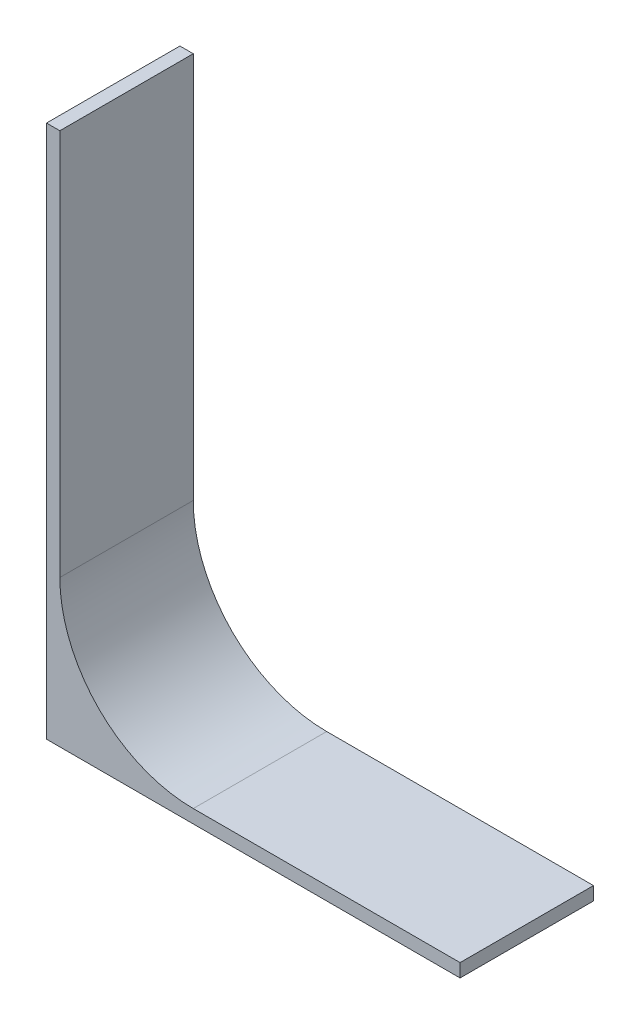
ISO-10303-21;
HEADER;
FILE_DESCRIPTION(('STEP AP214'),'2;1');
FILE_NAME('part.step','',(''),(''),'','','');
FILE_SCHEMA(('AUTOMOTIVE_DESIGN { 1 0 10303 214 1 1 1 1 }'));
ENDSEC;
DATA;
#1=APPLICATION_CONTEXT('core data for automotive mechanical design processes');
#2=APPLICATION_PROTOCOL_DEFINITION('international standard','automotive_design',2000,#1);
#3=PRODUCT_CONTEXT('',#1,'mechanical');
#4=PRODUCT('Part','Part','',(#3));
#5=PRODUCT_RELATED_PRODUCT_CATEGORY('part','',(#4));
#6=PRODUCT_DEFINITION_FORMATION('','',#4);
#7=PRODUCT_DEFINITION_CONTEXT('part definition',#1,'design');
#8=PRODUCT_DEFINITION('design','',#6,#7);
#9=PRODUCT_DEFINITION_SHAPE('','',#8);
#10=(LENGTH_UNIT() NAMED_UNIT(*) SI_UNIT(.MILLI.,.METRE.));
#11=(NAMED_UNIT(*) PLANE_ANGLE_UNIT() SI_UNIT($,.RADIAN.));
#12=(NAMED_UNIT(*) SI_UNIT($,.STERADIAN.) SOLID_ANGLE_UNIT());
#13=UNCERTAINTY_MEASURE_WITH_UNIT(LENGTH_MEASURE(1.E-05),#10,'distance_accuracy_value','');
#14=(GEOMETRIC_REPRESENTATION_CONTEXT(3) GLOBAL_UNCERTAINTY_ASSIGNED_CONTEXT((#13)) GLOBAL_UNIT_ASSIGNED_CONTEXT((#10,
#11,#12)) REPRESENTATION_CONTEXT('',''));
#15=CARTESIAN_POINT('',(0.,0.,0.));
#16=DIRECTION('',(0.,0.,1.));
#17=DIRECTION('',(1.,0.,0.));
#18=AXIS2_PLACEMENT_3D('',#15,#16,#17);
#19=CARTESIAN_POINT('',(10.,11.,0.));
#20=DIRECTION('',(0.,0.,-1.));
#21=DIRECTION('',(-1.,0.,0.));
#22=AXIS2_PLACEMENT_3D('',#19,#20,#21);
#23=CYLINDRICAL_SURFACE('',#22,10.);
#24=DIRECTION('',(0.,0.,1.));
#25=VECTOR('',#24,1.);
#26=CARTESIAN_POINT('',(10.,1.,0.));
#27=LINE('',#26,#25);
#28=CARTESIAN_POINT('',(10.,1.,-10.));
#29=VERTEX_POINT('',#28);
#30=CARTESIAN_POINT('',(10.,1.,0.));
#31=VERTEX_POINT('',#30);
#32=EDGE_CURVE('E167',#29,#31,#27,.T.);
#33=ORIENTED_EDGE('',*,*,#32,.F.);
#34=CARTESIAN_POINT('',(10.,11.,-10.));
#35=DIRECTION('',(0.,0.,1.));
#36=DIRECTION('',(1.,0.,0.));
#37=AXIS2_PLACEMENT_3D('',#34,#35,#36);
#38=CIRCLE('',#37,10.);
#39=CARTESIAN_POINT('',(0.,11.,-10.));
#40=VERTEX_POINT('',#39);
#41=EDGE_CURVE('E47',#29,#40,#38,.F.);
#42=ORIENTED_EDGE('',*,*,#41,.T.);
#43=DIRECTION('',(0.,0.,1.));
#44=VECTOR('',#43,1.);
#45=CARTESIAN_POINT('',(0.,11.,0.));
#46=LINE('',#45,#44);
#47=CARTESIAN_POINT('',(0.,11.,0.));
#48=VERTEX_POINT('',#47);
#49=EDGE_CURVE('E171',#48,#40,#46,.F.);
#50=ORIENTED_EDGE('',*,*,#49,.F.);
#51=CARTESIAN_POINT('',(10.,11.,0.));
#52=DIRECTION('',(0.,0.,-1.));
#53=DIRECTION('',(-1.,0.,0.));
#54=AXIS2_PLACEMENT_3D('',#51,#52,#53);
#55=CIRCLE('',#54,10.);
#56=EDGE_CURVE('E11',#48,#31,#55,.F.);
#57=ORIENTED_EDGE('',*,*,#56,.T.);
#58=EDGE_LOOP('',(#33,#42,#50,#57));
#59=FACE_BOUND('',#58,.T.);
#60=ADVANCED_FACE('F39',(#59),#23,.F.);
#61=CARTESIAN_POINT('',(0.,1.,0.));
#62=DIRECTION('',(0.,0.,-1.));
#63=DIRECTION('',(-1.,0.,0.));
#64=AXIS2_PLACEMENT_3D('',#61,#62,#63);
#65=PLANE('',#64);
#66=DIRECTION('',(1.,0.,0.));
#67=VECTOR('',#66,1.);
#68=CARTESIAN_POINT('',(0.,0.,0.));
#69=LINE('',#68,#67);
#70=CARTESIAN_POINT('',(-1.,0.,0.));
#71=VERTEX_POINT('',#70);
#72=CARTESIAN_POINT('',(30.,0.,0.));
#73=VERTEX_POINT('',#72);
#74=EDGE_CURVE('E96',#71,#73,#69,.T.);
#75=ORIENTED_EDGE('',*,*,#74,.T.);
#76=DIRECTION('',(0.,-1.,0.));
#77=VECTOR('',#76,1.);
#78=CARTESIAN_POINT('',(30.,1.,0.));
#79=LINE('',#78,#77);
#80=CARTESIAN_POINT('',(30.,1.,0.));
#81=VERTEX_POINT('',#80);
#82=EDGE_CURVE('E164',#81,#73,#79,.T.);
#83=ORIENTED_EDGE('',*,*,#82,.F.);
#84=DIRECTION('',(1.,0.,0.));
#85=VECTOR('',#84,1.);
#86=CARTESIAN_POINT('',(0.,1.,0.));
#87=LINE('',#86,#85);
#88=EDGE_CURVE('E145',#31,#81,#87,.T.);
#89=ORIENTED_EDGE('',*,*,#88,.F.);
#90=ORIENTED_EDGE('',*,*,#56,.F.);
#91=DIRECTION('',(0.,-1.,0.));
#92=VECTOR('',#91,1.);
#93=CARTESIAN_POINT('',(0.,0.,0.));
#94=LINE('',#93,#92);
#95=CARTESIAN_POINT('',(0.,40.,0.));
#96=VERTEX_POINT('',#95);
#97=EDGE_CURVE('E134',#96,#48,#94,.T.);
#98=ORIENTED_EDGE('',*,*,#97,.F.);
#99=DIRECTION('',(1.,0.,0.));
#100=VECTOR('',#99,1.);
#101=CARTESIAN_POINT('',(-1.,40.,0.));
#102=LINE('',#101,#100);
#103=CARTESIAN_POINT('',(-1.,40.,0.));
#104=VERTEX_POINT('',#103);
#105=EDGE_CURVE('E106',#104,#96,#102,.T.);
#106=ORIENTED_EDGE('',*,*,#105,.F.);
#107=DIRECTION('',(0.,-1.,0.));
#108=VECTOR('',#107,1.);
#109=CARTESIAN_POINT('',(-1.,0.,0.));
#110=LINE('',#109,#108);
#111=EDGE_CURVE('E113',#104,#71,#110,.T.);
#112=ORIENTED_EDGE('',*,*,#111,.T.);
#113=EDGE_LOOP('',(#75,#83,#89,#90,#98,#106,#112));
#114=FACE_BOUND('',#113,.T.);
#115=ADVANCED_FACE('F119',(#114),#65,.F.);
#116=CARTESIAN_POINT('',(30.,1.,0.));
#117=DIRECTION('',(-1.,0.,0.));
#118=DIRECTION('',(0.,0.,1.));
#119=AXIS2_PLACEMENT_3D('',#116,#117,#118);
#120=PLANE('',#119);
#121=DIRECTION('',(0.,0.,-1.));
#122=VECTOR('',#121,1.);
#123=CARTESIAN_POINT('',(30.,0.,0.));
#124=LINE('',#123,#122);
#125=CARTESIAN_POINT('',(30.,0.,-10.));
#126=VERTEX_POINT('',#125);
#127=EDGE_CURVE('E101',#73,#126,#124,.T.);
#128=ORIENTED_EDGE('',*,*,#127,.T.);
#129=DIRECTION('',(0.,-1.,0.));
#130=VECTOR('',#129,1.);
#131=CARTESIAN_POINT('',(30.,1.,-10.));
#132=LINE('',#131,#130);
#133=CARTESIAN_POINT('',(30.,1.,-10.));
#134=VERTEX_POINT('',#133);
#135=EDGE_CURVE('E155',#134,#126,#132,.T.);
#136=ORIENTED_EDGE('',*,*,#135,.F.);
#137=DIRECTION('',(0.,0.,-1.));
#138=VECTOR('',#137,1.);
#139=CARTESIAN_POINT('',(30.,1.,0.));
#140=LINE('',#139,#138);
#141=EDGE_CURVE('E148',#81,#134,#140,.T.);
#142=ORIENTED_EDGE('',*,*,#141,.F.);
#143=ORIENTED_EDGE('',*,*,#82,.T.);
#144=EDGE_LOOP('',(#128,#136,#142,#143));
#145=FACE_BOUND('',#144,.T.);
#146=ADVANCED_FACE('F198',(#145),#120,.F.);
#147=CARTESIAN_POINT('',(0.,1.,-10.));
#148=DIRECTION('',(0.,0.,1.));
#149=DIRECTION('',(1.,0.,0.));
#150=AXIS2_PLACEMENT_3D('',#147,#148,#149);
#151=PLANE('',#150);
#152=DIRECTION('',(-1.,0.,0.));
#153=VECTOR('',#152,1.);
#154=CARTESIAN_POINT('',(0.,0.,-10.));
#155=LINE('',#154,#153);
#156=CARTESIAN_POINT('',(-1.,0.,-10.));
#157=VERTEX_POINT('',#156);
#158=EDGE_CURVE('E149',#126,#157,#155,.T.);
#159=ORIENTED_EDGE('',*,*,#158,.T.);
#160=DIRECTION('',(0.,1.,0.));
#161=VECTOR('',#160,1.);
#162=CARTESIAN_POINT('',(-1.,0.,-10.));
#163=LINE('',#162,#161);
#164=CARTESIAN_POINT('',(-1.,40.,-10.));
#165=VERTEX_POINT('',#164);
#166=EDGE_CURVE('E116',#157,#165,#163,.T.);
#167=ORIENTED_EDGE('',*,*,#166,.T.);
#168=DIRECTION('',(1.,0.,0.));
#169=VECTOR('',#168,1.);
#170=CARTESIAN_POINT('',(-1.,40.,-10.));
#171=LINE('',#170,#169);
#172=CARTESIAN_POINT('',(0.,40.,-10.));
#173=VERTEX_POINT('',#172);
#174=EDGE_CURVE('E133',#165,#173,#171,.T.);
#175=ORIENTED_EDGE('',*,*,#174,.T.);
#176=DIRECTION('',(0.,1.,0.));
#177=VECTOR('',#176,1.);
#178=CARTESIAN_POINT('',(0.,0.,-10.));
#179=LINE('',#178,#177);
#180=EDGE_CURVE('E125',#40,#173,#179,.T.);
#181=ORIENTED_EDGE('',*,*,#180,.F.);
#182=ORIENTED_EDGE('',*,*,#41,.F.);
#183=DIRECTION('',(-1.,0.,0.));
#184=VECTOR('',#183,1.);
#185=CARTESIAN_POINT('',(0.,1.,-10.));
#186=LINE('',#185,#184);
#187=EDGE_CURVE('E152',#134,#29,#186,.T.);
#188=ORIENTED_EDGE('',*,*,#187,.F.);
#189=ORIENTED_EDGE('',*,*,#135,.T.);
#190=EDGE_LOOP('',(#159,#167,#175,#181,#182,#188,#189));
#191=FACE_BOUND('',#190,.T.);
#192=ADVANCED_FACE('F178',(#191),#151,.F.);
#193=CARTESIAN_POINT('',(0.,1.,0.));
#194=DIRECTION('',(0.,-1.,0.));
#195=DIRECTION('',(0.,0.,-1.));
#196=AXIS2_PLACEMENT_3D('',#193,#194,#195);
#197=PLANE('',#196);
#198=ORIENTED_EDGE('',*,*,#187,.T.);
#199=ORIENTED_EDGE('',*,*,#32,.T.);
#200=ORIENTED_EDGE('',*,*,#88,.T.);
#201=ORIENTED_EDGE('',*,*,#141,.T.);
#202=EDGE_LOOP('',(#198,#199,#200,#201));
#203=FACE_BOUND('',#202,.T.);
#204=ADVANCED_FACE('F190',(#203),#197,.F.);
#205=CARTESIAN_POINT('',(0.,0.,0.));
#206=DIRECTION('',(0.,-1.,0.));
#207=DIRECTION('',(0.,0.,-1.));
#208=AXIS2_PLACEMENT_3D('',#205,#206,#207);
#209=PLANE('',#208);
#210=ORIENTED_EDGE('',*,*,#74,.F.);
#211=DIRECTION('',(0.,0.,-1.));
#212=VECTOR('',#211,1.);
#213=CARTESIAN_POINT('',(-1.,0.,0.));
#214=LINE('',#213,#212);
#215=EDGE_CURVE('E100',#71,#157,#214,.T.);
#216=ORIENTED_EDGE('',*,*,#215,.T.);
#217=ORIENTED_EDGE('',*,*,#158,.F.);
#218=ORIENTED_EDGE('',*,*,#127,.F.);
#219=EDGE_LOOP('',(#210,#216,#217,#218));
#220=FACE_BOUND('',#219,.T.);
#221=ADVANCED_FACE('F98',(#220),#209,.T.);
#222=CARTESIAN_POINT('',(-1.,40.,0.));
#223=DIRECTION('',(0.,1.,0.));
#224=DIRECTION('',(0.,0.,1.));
#225=AXIS2_PLACEMENT_3D('',#222,#223,#224);
#226=PLANE('',#225);
#227=DIRECTION('',(0.,0.,1.));
#228=VECTOR('',#227,1.);
#229=CARTESIAN_POINT('',(0.,40.,0.));
#230=LINE('',#229,#228);
#231=EDGE_CURVE('E121',#173,#96,#230,.T.);
#232=ORIENTED_EDGE('',*,*,#231,.F.);
#233=ORIENTED_EDGE('',*,*,#174,.F.);
#234=DIRECTION('',(0.,0.,1.));
#235=VECTOR('',#234,1.);
#236=CARTESIAN_POINT('',(-1.,40.,0.));
#237=LINE('',#236,#235);
#238=EDGE_CURVE('E130',#165,#104,#237,.T.);
#239=ORIENTED_EDGE('',*,*,#238,.T.);
#240=ORIENTED_EDGE('',*,*,#105,.T.);
#241=EDGE_LOOP('',(#232,#233,#239,#240));
#242=FACE_BOUND('',#241,.T.);
#243=ADVANCED_FACE('F182',(#242),#226,.T.);
#244=CARTESIAN_POINT('',(-1.,0.,0.));
#245=DIRECTION('',(-1.,0.,0.));
#246=DIRECTION('',(0.,0.,1.));
#247=AXIS2_PLACEMENT_3D('',#244,#245,#246);
#248=PLANE('',#247);
#249=ORIENTED_EDGE('',*,*,#111,.F.);
#250=ORIENTED_EDGE('',*,*,#238,.F.);
#251=ORIENTED_EDGE('',*,*,#166,.F.);
#252=ORIENTED_EDGE('',*,*,#215,.F.);
#253=EDGE_LOOP('',(#249,#250,#251,#252));
#254=FACE_BOUND('',#253,.T.);
#255=ADVANCED_FACE('F111',(#254),#248,.T.);
#256=CARTESIAN_POINT('',(0.,0.,0.));
#257=DIRECTION('',(-1.,0.,0.));
#258=DIRECTION('',(0.,0.,1.));
#259=AXIS2_PLACEMENT_3D('',#256,#257,#258);
#260=PLANE('',#259);
#261=ORIENTED_EDGE('',*,*,#97,.T.);
#262=ORIENTED_EDGE('',*,*,#49,.T.);
#263=ORIENTED_EDGE('',*,*,#180,.T.);
#264=ORIENTED_EDGE('',*,*,#231,.T.);
#265=EDGE_LOOP('',(#261,#262,#263,#264));
#266=FACE_BOUND('',#265,.T.);
#267=ADVANCED_FACE('F176',(#266),#260,.F.);
#268=CLOSED_SHELL('',(#60,#115,#146,#192,#204,#221,#243,#255,#267));
#269=MANIFOLD_SOLID_BREP('B2',#268);
#270=ADVANCED_BREP_SHAPE_REPRESENTATION('',(#18,#269),#14);
#271=SHAPE_DEFINITION_REPRESENTATION(#9,#270);
ENDSEC;
END-ISO-10303-21;
